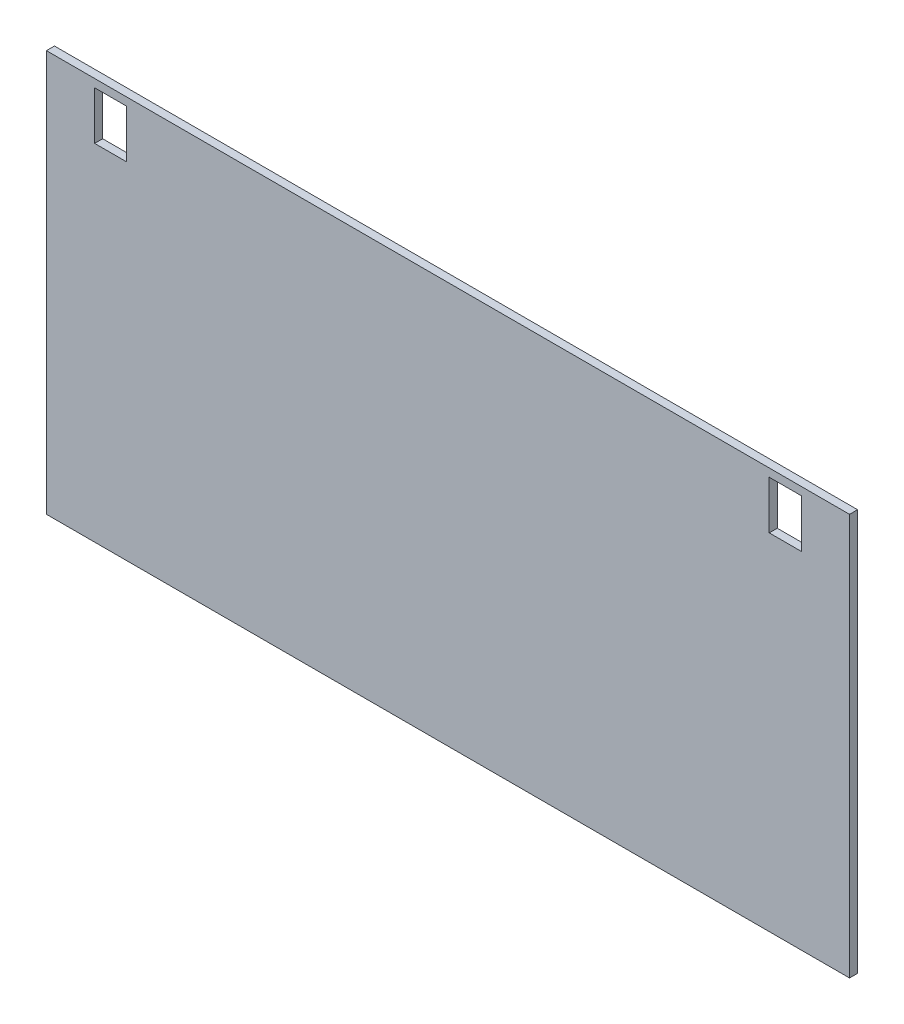
ISO-10303-21;
HEADER;
FILE_DESCRIPTION(('STEP AP214'),'2;1');
FILE_NAME('part.step','',(''),(''),'','','');
FILE_SCHEMA(('AUTOMOTIVE_DESIGN { 1 0 10303 214 1 1 1 1 }'));
ENDSEC;
DATA;
#1=APPLICATION_CONTEXT('core data for automotive mechanical design processes');
#2=APPLICATION_PROTOCOL_DEFINITION('international standard','automotive_design',2000,#1);
#3=PRODUCT_CONTEXT('',#1,'mechanical');
#4=PRODUCT('Part','Part','',(#3));
#5=PRODUCT_RELATED_PRODUCT_CATEGORY('part','',(#4));
#6=PRODUCT_DEFINITION_FORMATION('','',#4);
#7=PRODUCT_DEFINITION_CONTEXT('part definition',#1,'design');
#8=PRODUCT_DEFINITION('design','',#6,#7);
#9=PRODUCT_DEFINITION_SHAPE('','',#8);
#10=(LENGTH_UNIT() NAMED_UNIT(*) SI_UNIT(.MILLI.,.METRE.));
#11=(NAMED_UNIT(*) PLANE_ANGLE_UNIT() SI_UNIT($,.RADIAN.));
#12=(NAMED_UNIT(*) SI_UNIT($,.STERADIAN.) SOLID_ANGLE_UNIT());
#13=UNCERTAINTY_MEASURE_WITH_UNIT(LENGTH_MEASURE(1.E-05),#10,'distance_accuracy_value','');
#14=(GEOMETRIC_REPRESENTATION_CONTEXT(3) GLOBAL_UNCERTAINTY_ASSIGNED_CONTEXT((#13)) GLOBAL_UNIT_ASSIGNED_CONTEXT((#10,
#11,#12)) REPRESENTATION_CONTEXT('',''));
#15=CARTESIAN_POINT('',(0.,0.,0.));
#16=DIRECTION('',(0.,0.,1.));
#17=DIRECTION('',(1.,0.,0.));
#18=AXIS2_PLACEMENT_3D('',#15,#16,#17);
#19=CARTESIAN_POINT('',(0.,0.,0.5));
#20=DIRECTION('',(0.,0.,1.));
#21=DIRECTION('',(1.,0.,0.));
#22=AXIS2_PLACEMENT_3D('',#19,#20,#21);
#23=PLANE('',#22);
#24=DIRECTION('',(0.,-1.,0.));
#25=VECTOR('',#24,1.);
#26=CARTESIAN_POINT('',(-50.,25.,0.5));
#27=LINE('',#26,#25);
#28=CARTESIAN_POINT('',(-50.,25.,0.5));
#29=VERTEX_POINT('',#28);
#30=CARTESIAN_POINT('',(-50.,-25.,0.5));
#31=VERTEX_POINT('',#30);
#32=EDGE_CURVE('E189',#29,#31,#27,.T.);
#33=ORIENTED_EDGE('',*,*,#32,.T.);
#34=DIRECTION('',(1.,0.,0.));
#35=VECTOR('',#34,1.);
#36=CARTESIAN_POINT('',(-50.,-25.,0.5));
#37=LINE('',#36,#35);
#38=CARTESIAN_POINT('',(50.,-25.,0.5));
#39=VERTEX_POINT('',#38);
#40=EDGE_CURVE('E192',#31,#39,#37,.T.);
#41=ORIENTED_EDGE('',*,*,#40,.T.);
#42=DIRECTION('',(0.,1.,0.));
#43=VECTOR('',#42,1.);
#44=CARTESIAN_POINT('',(50.,25.,0.5));
#45=LINE('',#44,#43);
#46=CARTESIAN_POINT('',(50.,25.,0.5));
#47=VERTEX_POINT('',#46);
#48=EDGE_CURVE('E195',#39,#47,#45,.T.);
#49=ORIENTED_EDGE('',*,*,#48,.T.);
#50=DIRECTION('',(-1.,0.,0.));
#51=VECTOR('',#50,1.);
#52=CARTESIAN_POINT('',(-50.,25.,0.5));
#53=LINE('',#52,#51);
#54=EDGE_CURVE('E197',#47,#29,#53,.T.);
#55=ORIENTED_EDGE('',*,*,#54,.T.);
#56=EDGE_LOOP('',(#33,#41,#49,#55));
#57=FACE_BOUND('',#56,.T.);
#58=DIRECTION('',(1.,0.,0.));
#59=VECTOR('',#58,1.);
#60=CARTESIAN_POINT('',(-44.,18.,0.5));
#61=LINE('',#60,#59);
#62=CARTESIAN_POINT('',(-44.,18.,0.5));
#63=VERTEX_POINT('',#62);
#64=CARTESIAN_POINT('',(-40.,18.,0.5));
#65=VERTEX_POINT('',#64);
#66=EDGE_CURVE('E160',#63,#65,#61,.T.);
#67=ORIENTED_EDGE('',*,*,#66,.F.);
#68=DIRECTION('',(0.,-1.,0.));
#69=VECTOR('',#68,1.);
#70=CARTESIAN_POINT('',(-44.,24.,0.5));
#71=LINE('',#70,#69);
#72=CARTESIAN_POINT('',(-44.,24.,0.5));
#73=VERTEX_POINT('',#72);
#74=EDGE_CURVE('E158',#73,#63,#71,.T.);
#75=ORIENTED_EDGE('',*,*,#74,.F.);
#76=DIRECTION('',(-1.,0.,0.));
#77=VECTOR('',#76,1.);
#78=CARTESIAN_POINT('',(-44.,24.,0.5));
#79=LINE('',#78,#77);
#80=CARTESIAN_POINT('',(-40.,24.,0.5));
#81=VERTEX_POINT('',#80);
#82=EDGE_CURVE('E166',#81,#73,#79,.T.);
#83=ORIENTED_EDGE('',*,*,#82,.F.);
#84=DIRECTION('',(0.,1.,0.));
#85=VECTOR('',#84,1.);
#86=CARTESIAN_POINT('',(-40.,24.,0.5));
#87=LINE('',#86,#85);
#88=EDGE_CURVE('E163',#65,#81,#87,.T.);
#89=ORIENTED_EDGE('',*,*,#88,.F.);
#90=EDGE_LOOP('',(#67,#75,#83,#89));
#91=FACE_BOUND('',#90,.T.);
#92=DIRECTION('',(1.,0.,0.));
#93=VECTOR('',#92,1.);
#94=CARTESIAN_POINT('',(40.,18.,0.5));
#95=LINE('',#94,#93);
#96=CARTESIAN_POINT('',(40.,18.,0.5));
#97=VERTEX_POINT('',#96);
#98=CARTESIAN_POINT('',(44.,18.,0.5));
#99=VERTEX_POINT('',#98);
#100=EDGE_CURVE('E130',#97,#99,#95,.T.);
#101=ORIENTED_EDGE('',*,*,#100,.F.);
#102=DIRECTION('',(0.,-1.,0.));
#103=VECTOR('',#102,1.);
#104=CARTESIAN_POINT('',(40.,24.,0.5));
#105=LINE('',#104,#103);
#106=CARTESIAN_POINT('',(40.,24.,0.5));
#107=VERTEX_POINT('',#106);
#108=EDGE_CURVE('E122',#107,#97,#105,.T.);
#109=ORIENTED_EDGE('',*,*,#108,.F.);
#110=DIRECTION('',(-1.,0.,0.));
#111=VECTOR('',#110,1.);
#112=CARTESIAN_POINT('',(40.,24.,0.5));
#113=LINE('',#112,#111);
#114=CARTESIAN_POINT('',(44.,24.,0.5));
#115=VERTEX_POINT('',#114);
#116=EDGE_CURVE('E144',#115,#107,#113,.T.);
#117=ORIENTED_EDGE('',*,*,#116,.F.);
#118=DIRECTION('',(0.,1.,0.));
#119=VECTOR('',#118,1.);
#120=CARTESIAN_POINT('',(44.,24.,0.5));
#121=LINE('',#120,#119);
#122=EDGE_CURVE('E142',#99,#115,#121,.T.);
#123=ORIENTED_EDGE('',*,*,#122,.F.);
#124=EDGE_LOOP('',(#101,#109,#117,#123));
#125=FACE_BOUND('',#124,.T.);
#126=ADVANCED_FACE('F33',(#57,#91,#125),#23,.T.);
#127=CARTESIAN_POINT('',(0.,0.,-0.5));
#128=DIRECTION('',(0.,0.,1.));
#129=DIRECTION('',(1.,0.,0.));
#130=AXIS2_PLACEMENT_3D('',#127,#128,#129);
#131=PLANE('',#130);
#132=DIRECTION('',(0.,-1.,0.));
#133=VECTOR('',#132,1.);
#134=CARTESIAN_POINT('',(-44.,24.,-0.5));
#135=LINE('',#134,#133);
#136=CARTESIAN_POINT('',(-44.,24.,-0.5));
#137=VERTEX_POINT('',#136);
#138=CARTESIAN_POINT('',(-44.,18.,-0.5));
#139=VERTEX_POINT('',#138);
#140=EDGE_CURVE('E138',#137,#139,#135,.T.);
#141=ORIENTED_EDGE('',*,*,#140,.T.);
#142=DIRECTION('',(1.,0.,0.));
#143=VECTOR('',#142,1.);
#144=CARTESIAN_POINT('',(-44.,18.,-0.5));
#145=LINE('',#144,#143);
#146=CARTESIAN_POINT('',(-40.,18.,-0.5));
#147=VERTEX_POINT('',#146);
#148=EDGE_CURVE('E171',#139,#147,#145,.T.);
#149=ORIENTED_EDGE('',*,*,#148,.T.);
#150=DIRECTION('',(0.,1.,0.));
#151=VECTOR('',#150,1.);
#152=CARTESIAN_POINT('',(-40.,24.,-0.5));
#153=LINE('',#152,#151);
#154=CARTESIAN_POINT('',(-40.,24.,-0.5));
#155=VERTEX_POINT('',#154);
#156=EDGE_CURVE('E174',#147,#155,#153,.T.);
#157=ORIENTED_EDGE('',*,*,#156,.T.);
#158=DIRECTION('',(-1.,0.,0.));
#159=VECTOR('',#158,1.);
#160=CARTESIAN_POINT('',(-44.,24.,-0.5));
#161=LINE('',#160,#159);
#162=EDGE_CURVE('E161',#155,#137,#161,.T.);
#163=ORIENTED_EDGE('',*,*,#162,.T.);
#164=EDGE_LOOP('',(#141,#149,#157,#163));
#165=FACE_BOUND('',#164,.T.);
#166=DIRECTION('',(0.,-1.,0.));
#167=VECTOR('',#166,1.);
#168=CARTESIAN_POINT('',(-50.,25.,-0.5));
#169=LINE('',#168,#167);
#170=CARTESIAN_POINT('',(-50.,25.,-0.5));
#171=VERTEX_POINT('',#170);
#172=CARTESIAN_POINT('',(-50.,-25.,-0.5));
#173=VERTEX_POINT('',#172);
#174=EDGE_CURVE('E188',#171,#173,#169,.T.);
#175=ORIENTED_EDGE('',*,*,#174,.F.);
#176=DIRECTION('',(-1.,0.,0.));
#177=VECTOR('',#176,1.);
#178=CARTESIAN_POINT('',(-50.,25.,-0.5));
#179=LINE('',#178,#177);
#180=CARTESIAN_POINT('',(50.,25.,-0.5));
#181=VERTEX_POINT('',#180);
#182=EDGE_CURVE('E193',#181,#171,#179,.T.);
#183=ORIENTED_EDGE('',*,*,#182,.F.);
#184=DIRECTION('',(0.,1.,0.));
#185=VECTOR('',#184,1.);
#186=CARTESIAN_POINT('',(50.,25.,-0.5));
#187=LINE('',#186,#185);
#188=CARTESIAN_POINT('',(50.,-25.,-0.5));
#189=VERTEX_POINT('',#188);
#190=EDGE_CURVE('E204',#189,#181,#187,.T.);
#191=ORIENTED_EDGE('',*,*,#190,.F.);
#192=DIRECTION('',(1.,0.,0.));
#193=VECTOR('',#192,1.);
#194=CARTESIAN_POINT('',(-50.,-25.,-0.5));
#195=LINE('',#194,#193);
#196=EDGE_CURVE('E202',#173,#189,#195,.T.);
#197=ORIENTED_EDGE('',*,*,#196,.F.);
#198=EDGE_LOOP('',(#175,#183,#191,#197));
#199=FACE_BOUND('',#198,.T.);
#200=DIRECTION('',(0.,-1.,0.));
#201=VECTOR('',#200,1.);
#202=CARTESIAN_POINT('',(40.,24.,-0.5));
#203=LINE('',#202,#201);
#204=CARTESIAN_POINT('',(40.,24.,-0.5));
#205=VERTEX_POINT('',#204);
#206=CARTESIAN_POINT('',(40.,18.,-0.5));
#207=VERTEX_POINT('',#206);
#208=EDGE_CURVE('E56',#205,#207,#203,.T.);
#209=ORIENTED_EDGE('',*,*,#208,.T.);
#210=DIRECTION('',(1.,0.,0.));
#211=VECTOR('',#210,1.);
#212=CARTESIAN_POINT('',(40.,18.,-0.5));
#213=LINE('',#212,#211);
#214=CARTESIAN_POINT('',(44.,18.,-0.5));
#215=VERTEX_POINT('',#214);
#216=EDGE_CURVE('E137',#207,#215,#213,.T.);
#217=ORIENTED_EDGE('',*,*,#216,.T.);
#218=DIRECTION('',(0.,1.,0.));
#219=VECTOR('',#218,1.);
#220=CARTESIAN_POINT('',(44.,24.,-0.5));
#221=LINE('',#220,#219);
#222=CARTESIAN_POINT('',(44.,24.,-0.5));
#223=VERTEX_POINT('',#222);
#224=EDGE_CURVE('E150',#215,#223,#221,.T.);
#225=ORIENTED_EDGE('',*,*,#224,.T.);
#226=DIRECTION('',(-1.,0.,0.));
#227=VECTOR('',#226,1.);
#228=CARTESIAN_POINT('',(40.,24.,-0.5));
#229=LINE('',#228,#227);
#230=EDGE_CURVE('E131',#223,#205,#229,.T.);
#231=ORIENTED_EDGE('',*,*,#230,.T.);
#232=EDGE_LOOP('',(#209,#217,#225,#231));
#233=FACE_BOUND('',#232,.T.);
#234=ADVANCED_FACE('F222',(#165,#199,#233),#131,.F.);
#235=CARTESIAN_POINT('',(-50.,25.,0.5));
#236=DIRECTION('',(1.,0.,0.));
#237=DIRECTION('',(0.,0.,-1.));
#238=AXIS2_PLACEMENT_3D('',#235,#236,#237);
#239=PLANE('',#238);
#240=ORIENTED_EDGE('',*,*,#174,.T.);
#241=DIRECTION('',(0.,0.,-1.));
#242=VECTOR('',#241,1.);
#243=CARTESIAN_POINT('',(-50.,-25.,0.5));
#244=LINE('',#243,#242);
#245=EDGE_CURVE('E11',#31,#173,#244,.T.);
#246=ORIENTED_EDGE('',*,*,#245,.F.);
#247=ORIENTED_EDGE('',*,*,#32,.F.);
#248=DIRECTION('',(0.,0.,-1.));
#249=VECTOR('',#248,1.);
#250=CARTESIAN_POINT('',(-50.,25.,0.5));
#251=LINE('',#250,#249);
#252=EDGE_CURVE('E199',#29,#171,#251,.T.);
#253=ORIENTED_EDGE('',*,*,#252,.T.);
#254=EDGE_LOOP('',(#240,#246,#247,#253));
#255=FACE_BOUND('',#254,.T.);
#256=ADVANCED_FACE('F35',(#255),#239,.F.);
#257=CARTESIAN_POINT('',(-50.,-25.,0.5));
#258=DIRECTION('',(0.,1.,0.));
#259=DIRECTION('',(-1.,0.,0.));
#260=AXIS2_PLACEMENT_3D('',#257,#258,#259);
#261=PLANE('',#260);
#262=ORIENTED_EDGE('',*,*,#196,.T.);
#263=DIRECTION('',(0.,0.,-1.));
#264=VECTOR('',#263,1.);
#265=CARTESIAN_POINT('',(50.,-25.,0.5));
#266=LINE('',#265,#264);
#267=EDGE_CURVE('E41',#39,#189,#266,.T.);
#268=ORIENTED_EDGE('',*,*,#267,.F.);
#269=ORIENTED_EDGE('',*,*,#40,.F.);
#270=ORIENTED_EDGE('',*,*,#245,.T.);
#271=EDGE_LOOP('',(#262,#268,#269,#270));
#272=FACE_BOUND('',#271,.T.);
#273=ADVANCED_FACE('F233',(#272),#261,.F.);
#274=CARTESIAN_POINT('',(50.,25.,0.5));
#275=DIRECTION('',(-1.,0.,0.));
#276=DIRECTION('',(0.,0.,1.));
#277=AXIS2_PLACEMENT_3D('',#274,#275,#276);
#278=PLANE('',#277);
#279=ORIENTED_EDGE('',*,*,#190,.T.);
#280=DIRECTION('',(0.,0.,-1.));
#281=VECTOR('',#280,1.);
#282=CARTESIAN_POINT('',(50.,25.,0.5));
#283=LINE('',#282,#281);
#284=EDGE_CURVE('E209',#47,#181,#283,.T.);
#285=ORIENTED_EDGE('',*,*,#284,.F.);
#286=ORIENTED_EDGE('',*,*,#48,.F.);
#287=ORIENTED_EDGE('',*,*,#267,.T.);
#288=EDGE_LOOP('',(#279,#285,#286,#287));
#289=FACE_BOUND('',#288,.T.);
#290=ADVANCED_FACE('F216',(#289),#278,.F.);
#291=CARTESIAN_POINT('',(-50.,25.,0.5));
#292=DIRECTION('',(0.,-1.,0.));
#293=DIRECTION('',(0.,0.,-1.));
#294=AXIS2_PLACEMENT_3D('',#291,#292,#293);
#295=PLANE('',#294);
#296=ORIENTED_EDGE('',*,*,#182,.T.);
#297=ORIENTED_EDGE('',*,*,#252,.F.);
#298=ORIENTED_EDGE('',*,*,#54,.F.);
#299=ORIENTED_EDGE('',*,*,#284,.T.);
#300=EDGE_LOOP('',(#296,#297,#298,#299));
#301=FACE_BOUND('',#300,.T.);
#302=ADVANCED_FACE('F226',(#301),#295,.F.);
#303=CARTESIAN_POINT('',(-44.,24.,0.5));
#304=DIRECTION('',(1.,0.,0.));
#305=DIRECTION('',(0.,1.,0.));
#306=AXIS2_PLACEMENT_3D('',#303,#304,#305);
#307=PLANE('',#306);
#308=ORIENTED_EDGE('',*,*,#140,.F.);
#309=DIRECTION('',(0.,0.,-1.));
#310=VECTOR('',#309,1.);
#311=CARTESIAN_POINT('',(-44.,24.,0.5));
#312=LINE('',#311,#310);
#313=EDGE_CURVE('E168',#73,#137,#312,.T.);
#314=ORIENTED_EDGE('',*,*,#313,.F.);
#315=ORIENTED_EDGE('',*,*,#74,.T.);
#316=DIRECTION('',(0.,0.,-1.));
#317=VECTOR('',#316,1.);
#318=CARTESIAN_POINT('',(-44.,18.,0.5));
#319=LINE('',#318,#317);
#320=EDGE_CURVE('E185',#63,#139,#319,.T.);
#321=ORIENTED_EDGE('',*,*,#320,.T.);
#322=EDGE_LOOP('',(#308,#314,#315,#321));
#323=FACE_BOUND('',#322,.T.);
#324=ADVANCED_FACE('F248',(#323),#307,.T.);
#325=CARTESIAN_POINT('',(-44.,18.,0.5));
#326=DIRECTION('',(0.,1.,0.));
#327=DIRECTION('',(0.,0.,1.));
#328=AXIS2_PLACEMENT_3D('',#325,#326,#327);
#329=PLANE('',#328);
#330=ORIENTED_EDGE('',*,*,#148,.F.);
#331=ORIENTED_EDGE('',*,*,#320,.F.);
#332=ORIENTED_EDGE('',*,*,#66,.T.);
#333=DIRECTION('',(0.,0.,-1.));
#334=VECTOR('',#333,1.);
#335=CARTESIAN_POINT('',(-40.,18.,0.5));
#336=LINE('',#335,#334);
#337=EDGE_CURVE('E183',#65,#147,#336,.T.);
#338=ORIENTED_EDGE('',*,*,#337,.T.);
#339=EDGE_LOOP('',(#330,#331,#332,#338));
#340=FACE_BOUND('',#339,.T.);
#341=ADVANCED_FACE('F255',(#340),#329,.T.);
#342=CARTESIAN_POINT('',(-40.,24.,0.5));
#343=DIRECTION('',(-1.,0.,0.));
#344=DIRECTION('',(0.,0.,1.));
#345=AXIS2_PLACEMENT_3D('',#342,#343,#344);
#346=PLANE('',#345);
#347=ORIENTED_EDGE('',*,*,#156,.F.);
#348=ORIENTED_EDGE('',*,*,#337,.F.);
#349=ORIENTED_EDGE('',*,*,#88,.T.);
#350=DIRECTION('',(0.,0.,-1.));
#351=VECTOR('',#350,1.);
#352=CARTESIAN_POINT('',(-40.,24.,0.5));
#353=LINE('',#352,#351);
#354=EDGE_CURVE('E181',#81,#155,#353,.T.);
#355=ORIENTED_EDGE('',*,*,#354,.T.);
#356=EDGE_LOOP('',(#347,#348,#349,#355));
#357=FACE_BOUND('',#356,.T.);
#358=ADVANCED_FACE('F260',(#357),#346,.T.);
#359=CARTESIAN_POINT('',(-44.,24.,0.5));
#360=DIRECTION('',(0.,-1.,0.));
#361=DIRECTION('',(0.,0.,-1.));
#362=AXIS2_PLACEMENT_3D('',#359,#360,#361);
#363=PLANE('',#362);
#364=ORIENTED_EDGE('',*,*,#162,.F.);
#365=ORIENTED_EDGE('',*,*,#354,.F.);
#366=ORIENTED_EDGE('',*,*,#82,.T.);
#367=ORIENTED_EDGE('',*,*,#313,.T.);
#368=EDGE_LOOP('',(#364,#365,#366,#367));
#369=FACE_BOUND('',#368,.T.);
#370=ADVANCED_FACE('F267',(#369),#363,.T.);
#371=CARTESIAN_POINT('',(40.,24.,0.5));
#372=DIRECTION('',(1.,0.,0.));
#373=DIRECTION('',(0.,1.,0.));
#374=AXIS2_PLACEMENT_3D('',#371,#372,#373);
#375=PLANE('',#374);
#376=ORIENTED_EDGE('',*,*,#208,.F.);
#377=DIRECTION('',(0.,0.,-1.));
#378=VECTOR('',#377,1.);
#379=CARTESIAN_POINT('',(40.,24.,0.5));
#380=LINE('',#379,#378);
#381=EDGE_CURVE('E126',#107,#205,#380,.T.);
#382=ORIENTED_EDGE('',*,*,#381,.F.);
#383=ORIENTED_EDGE('',*,*,#108,.T.);
#384=DIRECTION('',(0.,0.,-1.));
#385=VECTOR('',#384,1.);
#386=CARTESIAN_POINT('',(40.,18.,0.5));
#387=LINE('',#386,#385);
#388=EDGE_CURVE('E125',#97,#207,#387,.T.);
#389=ORIENTED_EDGE('',*,*,#388,.T.);
#390=EDGE_LOOP('',(#376,#382,#383,#389));
#391=FACE_BOUND('',#390,.T.);
#392=ADVANCED_FACE('F124',(#391),#375,.T.);
#393=CARTESIAN_POINT('',(40.,18.,0.5));
#394=DIRECTION('',(0.,1.,0.));
#395=DIRECTION('',(0.,0.,1.));
#396=AXIS2_PLACEMENT_3D('',#393,#394,#395);
#397=PLANE('',#396);
#398=ORIENTED_EDGE('',*,*,#216,.F.);
#399=ORIENTED_EDGE('',*,*,#388,.F.);
#400=ORIENTED_EDGE('',*,*,#100,.T.);
#401=DIRECTION('',(0.,0.,-1.));
#402=VECTOR('',#401,1.);
#403=CARTESIAN_POINT('',(44.,18.,0.5));
#404=LINE('',#403,#402);
#405=EDGE_CURVE('E139',#99,#215,#404,.T.);
#406=ORIENTED_EDGE('',*,*,#405,.T.);
#407=EDGE_LOOP('',(#398,#399,#400,#406));
#408=FACE_BOUND('',#407,.T.);
#409=ADVANCED_FACE('F134',(#408),#397,.T.);
#410=CARTESIAN_POINT('',(44.,24.,0.5));
#411=DIRECTION('',(-1.,0.,0.));
#412=DIRECTION('',(0.,-1.,0.));
#413=AXIS2_PLACEMENT_3D('',#410,#411,#412);
#414=PLANE('',#413);
#415=ORIENTED_EDGE('',*,*,#224,.F.);
#416=ORIENTED_EDGE('',*,*,#405,.F.);
#417=ORIENTED_EDGE('',*,*,#122,.T.);
#418=DIRECTION('',(0.,0.,-1.));
#419=VECTOR('',#418,1.);
#420=CARTESIAN_POINT('',(44.,24.,0.5));
#421=LINE('',#420,#419);
#422=EDGE_CURVE('E48',#115,#223,#421,.T.);
#423=ORIENTED_EDGE('',*,*,#422,.T.);
#424=EDGE_LOOP('',(#415,#416,#417,#423));
#425=FACE_BOUND('',#424,.T.);
#426=ADVANCED_FACE('F285',(#425),#414,.T.);
#427=CARTESIAN_POINT('',(40.,24.,0.5));
#428=DIRECTION('',(0.,-1.,0.));
#429=DIRECTION('',(0.,0.,-1.));
#430=AXIS2_PLACEMENT_3D('',#427,#428,#429);
#431=PLANE('',#430);
#432=ORIENTED_EDGE('',*,*,#230,.F.);
#433=ORIENTED_EDGE('',*,*,#422,.F.);
#434=ORIENTED_EDGE('',*,*,#116,.T.);
#435=ORIENTED_EDGE('',*,*,#381,.T.);
#436=EDGE_LOOP('',(#432,#433,#434,#435));
#437=FACE_BOUND('',#436,.T.);
#438=ADVANCED_FACE('F288',(#437),#431,.T.);
#439=CLOSED_SHELL('',(#126,#234,#256,#273,#290,#302,#324,#341,#358,#370,#392,#409,#426,#438));
#440=MANIFOLD_SOLID_BREP('B2',#439);
#441=ADVANCED_BREP_SHAPE_REPRESENTATION('',(#18,#440),#14);
#442=SHAPE_DEFINITION_REPRESENTATION(#9,#441);
ENDSEC;
END-ISO-10303-21;
